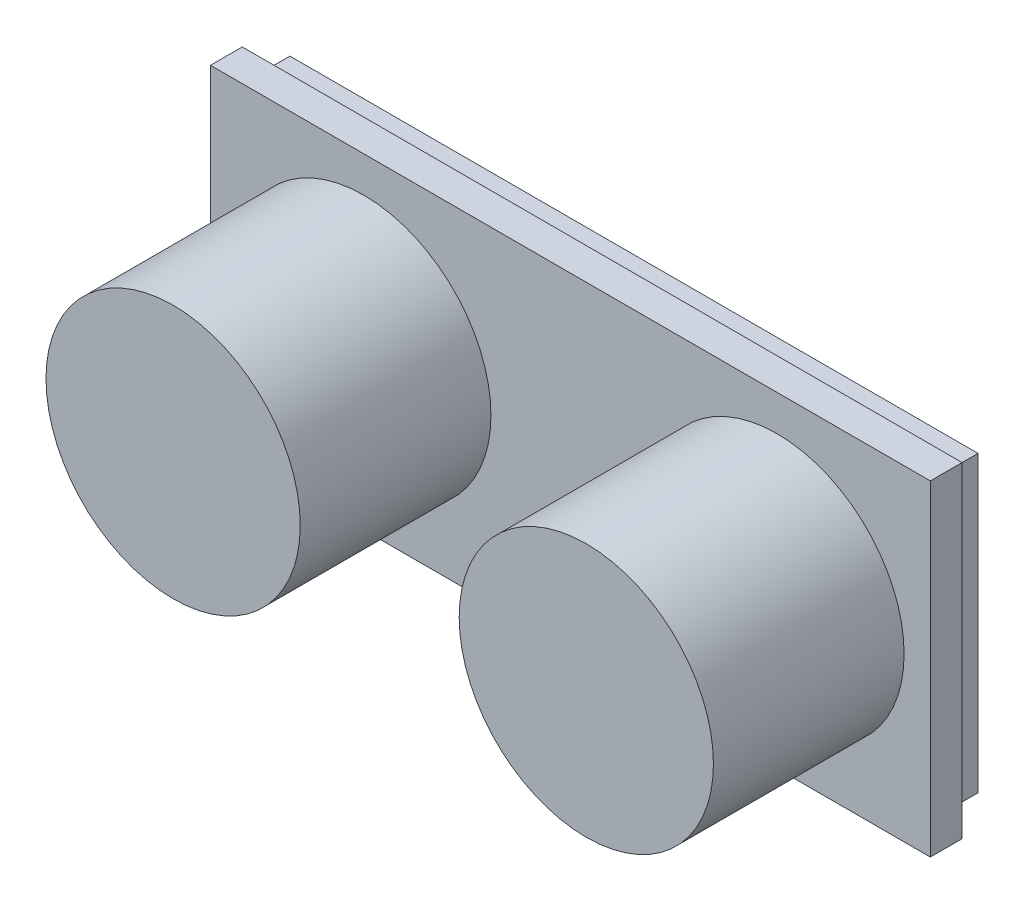
ISO-10303-21;
HEADER;
FILE_DESCRIPTION(('STEP AP214'),'2;1');
FILE_NAME('part.step','',(''),(''),'','','');
FILE_SCHEMA(('AUTOMOTIVE_DESIGN { 1 0 10303 214 1 1 1 1 }'));
ENDSEC;
DATA;
#1=APPLICATION_CONTEXT('core data for automotive mechanical design processes');
#2=APPLICATION_PROTOCOL_DEFINITION('international standard','automotive_design',2000,#1);
#3=PRODUCT_CONTEXT('',#1,'mechanical');
#4=PRODUCT('Part','Part','',(#3));
#5=PRODUCT_RELATED_PRODUCT_CATEGORY('part','',(#4));
#6=PRODUCT_DEFINITION_FORMATION('','',#4);
#7=PRODUCT_DEFINITION_CONTEXT('part definition',#1,'design');
#8=PRODUCT_DEFINITION('design','',#6,#7);
#9=PRODUCT_DEFINITION_SHAPE('','',#8);
#10=(LENGTH_UNIT() NAMED_UNIT(*) SI_UNIT(.MILLI.,.METRE.));
#11=(NAMED_UNIT(*) PLANE_ANGLE_UNIT() SI_UNIT($,.RADIAN.));
#12=(NAMED_UNIT(*) SI_UNIT($,.STERADIAN.) SOLID_ANGLE_UNIT());
#13=UNCERTAINTY_MEASURE_WITH_UNIT(LENGTH_MEASURE(1.E-05),#10,'distance_accuracy_value','');
#14=(GEOMETRIC_REPRESENTATION_CONTEXT(3) GLOBAL_UNCERTAINTY_ASSIGNED_CONTEXT((#13)) GLOBAL_UNIT_ASSIGNED_CONTEXT((#10,
#11,#12)) REPRESENTATION_CONTEXT('',''));
#15=CARTESIAN_POINT('',(0.,0.,0.));
#16=DIRECTION('',(0.,0.,1.));
#17=DIRECTION('',(1.,0.,0.));
#18=AXIS2_PLACEMENT_3D('',#15,#16,#17);
#19=CARTESIAN_POINT('',(0.,0.,0.));
#20=DIRECTION('',(0.,0.,-1.));
#21=DIRECTION('',(-1.,0.,0.));
#22=AXIS2_PLACEMENT_3D('',#19,#20,#21);
#23=PLANE('',#22);
#24=DIRECTION('',(0.,-1.,0.));
#25=VECTOR('',#24,1.);
#26=CARTESIAN_POINT('',(5.,-17.25,0.));
#27=LINE('',#26,#25);
#28=CARTESIAN_POINT('',(5.,-7.25,0.));
#29=VERTEX_POINT('',#28);
#30=CARTESIAN_POINT('',(5.,-10.25,0.));
#31=VERTEX_POINT('',#30);
#32=EDGE_CURVE('E65',#29,#31,#27,.T.);
#33=ORIENTED_EDGE('',*,*,#32,.F.);
#34=DIRECTION('',(1.,0.,0.));
#35=VECTOR('',#34,1.);
#36=CARTESIAN_POINT('',(5.,-7.25,0.));
#37=LINE('',#36,#35);
#38=CARTESIAN_POINT('',(-5.,-7.25,0.));
#39=VERTEX_POINT('',#38);
#40=EDGE_CURVE('E209',#39,#29,#37,.T.);
#41=ORIENTED_EDGE('',*,*,#40,.F.);
#42=DIRECTION('',(0.,1.,0.));
#43=VECTOR('',#42,1.);
#44=CARTESIAN_POINT('',(-5.,-17.25,0.));
#45=LINE('',#44,#43);
#46=CARTESIAN_POINT('',(-5.,-10.25,0.));
#47=VERTEX_POINT('',#46);
#48=EDGE_CURVE('E228',#47,#39,#45,.T.);
#49=ORIENTED_EDGE('',*,*,#48,.F.);
#50=DIRECTION('',(1.,0.,0.));
#51=VECTOR('',#50,1.);
#52=CARTESIAN_POINT('',(-22.65,-10.25,0.));
#53=LINE('',#52,#51);
#54=CARTESIAN_POINT('',(-22.65,-10.25,0.));
#55=VERTEX_POINT('',#54);
#56=EDGE_CURVE('E252',#55,#47,#53,.T.);
#57=ORIENTED_EDGE('',*,*,#56,.F.);
#58=DIRECTION('',(0.,-1.,0.));
#59=VECTOR('',#58,1.);
#60=CARTESIAN_POINT('',(-22.65,-10.25,0.));
#61=LINE('',#60,#59);
#62=CARTESIAN_POINT('',(-22.65,10.25,0.));
#63=VERTEX_POINT('',#62);
#64=EDGE_CURVE('E268',#63,#55,#61,.T.);
#65=ORIENTED_EDGE('',*,*,#64,.F.);
#66=DIRECTION('',(-1.,0.,0.));
#67=VECTOR('',#66,1.);
#68=CARTESIAN_POINT('',(-22.65,10.25,0.));
#69=LINE('',#68,#67);
#70=CARTESIAN_POINT('',(22.65,10.25,0.));
#71=VERTEX_POINT('',#70);
#72=EDGE_CURVE('E265',#71,#63,#69,.T.);
#73=ORIENTED_EDGE('',*,*,#72,.F.);
#74=DIRECTION('',(0.,1.,0.));
#75=VECTOR('',#74,1.);
#76=CARTESIAN_POINT('',(22.65,-10.25,0.));
#77=LINE('',#76,#75);
#78=CARTESIAN_POINT('',(22.65,-10.25,0.));
#79=VERTEX_POINT('',#78);
#80=EDGE_CURVE('E246',#79,#71,#77,.T.);
#81=ORIENTED_EDGE('',*,*,#80,.F.);
#82=EDGE_CURVE('E271',#31,#79,#53,.T.);
#83=ORIENTED_EDGE('',*,*,#82,.F.);
#84=EDGE_LOOP('',(#33,#41,#49,#57,#65,#73,#81,#83));
#85=FACE_BOUND('',#84,.T.);
#86=DIRECTION('',(0.,1.,0.));
#87=VECTOR('',#86,1.);
#88=CARTESIAN_POINT('',(6.,-9.25,0.));
#89=LINE('',#88,#87);
#90=CARTESIAN_POINT('',(6.,-9.25,0.));
#91=VERTEX_POINT('',#90);
#92=CARTESIAN_POINT('',(6.,-6.25,0.));
#93=VERTEX_POINT('',#92);
#94=EDGE_CURVE('E587',#91,#93,#89,.T.);
#95=ORIENTED_EDGE('',*,*,#94,.F.);
#96=DIRECTION('',(-1.,0.,0.));
#97=VECTOR('',#96,1.);
#98=CARTESIAN_POINT('',(21.65,-9.25,0.));
#99=LINE('',#98,#97);
#100=CARTESIAN_POINT('',(21.65,-9.25,0.));
#101=VERTEX_POINT('',#100);
#102=EDGE_CURVE('E186',#101,#91,#99,.T.);
#103=ORIENTED_EDGE('',*,*,#102,.F.);
#104=DIRECTION('',(0.,-1.,0.));
#105=VECTOR('',#104,1.);
#106=CARTESIAN_POINT('',(21.65,9.25,0.));
#107=LINE('',#106,#105);
#108=CARTESIAN_POINT('',(21.65,9.25,0.));
#109=VERTEX_POINT('',#108);
#110=EDGE_CURVE('E182',#109,#101,#107,.T.);
#111=ORIENTED_EDGE('',*,*,#110,.F.);
#112=DIRECTION('',(1.,0.,0.));
#113=VECTOR('',#112,1.);
#114=CARTESIAN_POINT('',(-21.65,9.25,0.));
#115=LINE('',#114,#113);
#116=CARTESIAN_POINT('',(-21.65,9.25,0.));
#117=VERTEX_POINT('',#116);
#118=EDGE_CURVE('E582',#117,#109,#115,.T.);
#119=ORIENTED_EDGE('',*,*,#118,.F.);
#120=DIRECTION('',(0.,1.,0.));
#121=VECTOR('',#120,1.);
#122=CARTESIAN_POINT('',(-21.65,-9.25,0.));
#123=LINE('',#122,#121);
#124=CARTESIAN_POINT('',(-21.65,-9.25,0.));
#125=VERTEX_POINT('',#124);
#126=EDGE_CURVE('E604',#125,#117,#123,.T.);
#127=ORIENTED_EDGE('',*,*,#126,.F.);
#128=DIRECTION('',(-1.,0.,0.));
#129=VECTOR('',#128,1.);
#130=CARTESIAN_POINT('',(-6.,-9.25,0.));
#131=LINE('',#130,#129);
#132=CARTESIAN_POINT('',(-6.,-9.25,0.));
#133=VERTEX_POINT('',#132);
#134=EDGE_CURVE('E601',#133,#125,#131,.T.);
#135=ORIENTED_EDGE('',*,*,#134,.F.);
#136=DIRECTION('',(0.,-1.,0.));
#137=VECTOR('',#136,1.);
#138=CARTESIAN_POINT('',(-6.,-6.25,0.));
#139=LINE('',#138,#137);
#140=CARTESIAN_POINT('',(-6.,-6.25,0.));
#141=VERTEX_POINT('',#140);
#142=EDGE_CURVE('E598',#141,#133,#139,.T.);
#143=ORIENTED_EDGE('',*,*,#142,.F.);
#144=DIRECTION('',(-1.,0.,0.));
#145=VECTOR('',#144,1.);
#146=CARTESIAN_POINT('',(6.,-6.25,0.));
#147=LINE('',#146,#145);
#148=EDGE_CURVE('E591',#93,#141,#147,.T.);
#149=ORIENTED_EDGE('',*,*,#148,.F.);
#150=EDGE_LOOP('',(#95,#103,#111,#119,#127,#135,#143,#149));
#151=FACE_BOUND('',#150,.T.);
#152=ADVANCED_FACE('F41',(#85,#151),#23,.T.);
#153=CARTESIAN_POINT('',(22.65,-10.25,2.));
#154=DIRECTION('',(-1.,0.,0.));
#155=DIRECTION('',(0.,0.,1.));
#156=AXIS2_PLACEMENT_3D('',#153,#154,#155);
#157=PLANE('',#156);
#158=ORIENTED_EDGE('',*,*,#80,.T.);
#159=DIRECTION('',(0.,0.,-1.));
#160=VECTOR('',#159,1.);
#161=CARTESIAN_POINT('',(22.65,10.25,2.));
#162=LINE('',#161,#160);
#163=CARTESIAN_POINT('',(22.65,10.25,2.));
#164=VERTEX_POINT('',#163);
#165=EDGE_CURVE('E287',#164,#71,#162,.T.);
#166=ORIENTED_EDGE('',*,*,#165,.F.);
#167=DIRECTION('',(0.,1.,0.));
#168=VECTOR('',#167,1.);
#169=CARTESIAN_POINT('',(22.65,-10.25,2.));
#170=LINE('',#169,#168);
#171=CARTESIAN_POINT('',(22.65,-10.25,2.));
#172=VERTEX_POINT('',#171);
#173=EDGE_CURVE('E247',#172,#164,#170,.T.);
#174=ORIENTED_EDGE('',*,*,#173,.F.);
#175=DIRECTION('',(0.,0.,-1.));
#176=VECTOR('',#175,1.);
#177=CARTESIAN_POINT('',(22.65,-10.25,2.));
#178=LINE('',#177,#176);
#179=EDGE_CURVE('E261',#172,#79,#178,.T.);
#180=ORIENTED_EDGE('',*,*,#179,.T.);
#181=EDGE_LOOP('',(#158,#166,#174,#180));
#182=FACE_BOUND('',#181,.T.);
#183=ADVANCED_FACE('F43',(#182),#157,.F.);
#184=CARTESIAN_POINT('',(-22.65,10.25,2.));
#185=DIRECTION('',(0.,-1.,0.));
#186=DIRECTION('',(0.,0.,-1.));
#187=AXIS2_PLACEMENT_3D('',#184,#185,#186);
#188=PLANE('',#187);
#189=ORIENTED_EDGE('',*,*,#72,.T.);
#190=DIRECTION('',(0.,0.,-1.));
#191=VECTOR('',#190,1.);
#192=CARTESIAN_POINT('',(-22.65,10.25,2.));
#193=LINE('',#192,#191);
#194=CARTESIAN_POINT('',(-22.65,10.25,2.));
#195=VERTEX_POINT('',#194);
#196=EDGE_CURVE('E283',#195,#63,#193,.T.);
#197=ORIENTED_EDGE('',*,*,#196,.F.);
#198=DIRECTION('',(-1.,0.,0.));
#199=VECTOR('',#198,1.);
#200=CARTESIAN_POINT('',(-22.65,10.25,2.));
#201=LINE('',#200,#199);
#202=EDGE_CURVE('E251',#164,#195,#201,.T.);
#203=ORIENTED_EDGE('',*,*,#202,.F.);
#204=ORIENTED_EDGE('',*,*,#165,.T.);
#205=EDGE_LOOP('',(#189,#197,#203,#204));
#206=FACE_BOUND('',#205,.T.);
#207=ADVANCED_FACE('F332',(#206),#188,.F.);
#208=CARTESIAN_POINT('',(-22.65,-10.25,2.));
#209=DIRECTION('',(1.,0.,0.));
#210=DIRECTION('',(0.,0.,-1.));
#211=AXIS2_PLACEMENT_3D('',#208,#209,#210);
#212=PLANE('',#211);
#213=ORIENTED_EDGE('',*,*,#64,.T.);
#214=DIRECTION('',(0.,0.,-1.));
#215=VECTOR('',#214,1.);
#216=CARTESIAN_POINT('',(-22.65,-10.25,2.));
#217=LINE('',#216,#215);
#218=CARTESIAN_POINT('',(-22.65,-10.25,2.));
#219=VERTEX_POINT('',#218);
#220=EDGE_CURVE('E279',#219,#55,#217,.T.);
#221=ORIENTED_EDGE('',*,*,#220,.F.);
#222=DIRECTION('',(0.,-1.,0.));
#223=VECTOR('',#222,1.);
#224=CARTESIAN_POINT('',(-22.65,-10.25,2.));
#225=LINE('',#224,#223);
#226=EDGE_CURVE('E255',#195,#219,#225,.T.);
#227=ORIENTED_EDGE('',*,*,#226,.F.);
#228=ORIENTED_EDGE('',*,*,#196,.T.);
#229=EDGE_LOOP('',(#213,#221,#227,#228));
#230=FACE_BOUND('',#229,.T.);
#231=ADVANCED_FACE('F338',(#230),#212,.F.);
#232=CARTESIAN_POINT('',(-22.65,-10.25,2.));
#233=DIRECTION('',(0.,1.,0.));
#234=DIRECTION('',(0.,0.,1.));
#235=AXIS2_PLACEMENT_3D('',#232,#233,#234);
#236=PLANE('',#235);
#237=ORIENTED_EDGE('',*,*,#56,.T.);
#238=EDGE_CURVE('E275',#47,#31,#53,.T.);
#239=ORIENTED_EDGE('',*,*,#238,.T.);
#240=ORIENTED_EDGE('',*,*,#82,.T.);
#241=ORIENTED_EDGE('',*,*,#179,.F.);
#242=DIRECTION('',(1.,0.,0.));
#243=VECTOR('',#242,1.);
#244=CARTESIAN_POINT('',(-22.65,-10.25,2.));
#245=LINE('',#244,#243);
#246=EDGE_CURVE('E258',#219,#172,#245,.T.);
#247=ORIENTED_EDGE('',*,*,#246,.F.);
#248=ORIENTED_EDGE('',*,*,#220,.T.);
#249=EDGE_LOOP('',(#237,#239,#240,#241,#247,#248));
#250=FACE_BOUND('',#249,.T.);
#251=ADVANCED_FACE('F322',(#250),#236,.F.);
#252=CARTESIAN_POINT('',(0.,0.,2.));
#253=DIRECTION('',(0.,0.,-1.));
#254=DIRECTION('',(-1.,0.,0.));
#255=AXIS2_PLACEMENT_3D('',#252,#253,#254);
#256=PLANE('',#255);
#257=CARTESIAN_POINT('',(-13.,0.,2.));
#258=DIRECTION('',(0.,0.,-1.));
#259=DIRECTION('',(-1.,0.,0.));
#260=AXIS2_PLACEMENT_3D('',#257,#258,#259);
#261=CIRCLE('',#260,8.);
#262=CARTESIAN_POINT('',(-21.,0.,2.));
#263=VERTEX_POINT('',#262);
#264=EDGE_CURVE('E11',#263,#263,#261,.F.);
#265=ORIENTED_EDGE('',*,*,#264,.F.);
#266=EDGE_LOOP('',(#265));
#267=FACE_BOUND('',#266,.T.);
#268=CARTESIAN_POINT('',(13.,0.,2.));
#269=DIRECTION('',(0.,0.,-1.));
#270=DIRECTION('',(-1.,0.,0.));
#271=AXIS2_PLACEMENT_3D('',#268,#269,#270);
#272=CIRCLE('',#271,8.);
#273=CARTESIAN_POINT('',(5.,0.,2.));
#274=VERTEX_POINT('',#273);
#275=EDGE_CURVE('E50',#274,#274,#272,.F.);
#276=ORIENTED_EDGE('',*,*,#275,.F.);
#277=EDGE_LOOP('',(#276));
#278=FACE_BOUND('',#277,.T.);
#279=ORIENTED_EDGE('',*,*,#173,.T.);
#280=ORIENTED_EDGE('',*,*,#202,.T.);
#281=ORIENTED_EDGE('',*,*,#226,.T.);
#282=ORIENTED_EDGE('',*,*,#246,.T.);
#283=EDGE_LOOP('',(#279,#280,#281,#282));
#284=FACE_BOUND('',#283,.T.);
#285=ADVANCED_FACE('F335',(#267,#278,#284),#256,.F.);
#286=CARTESIAN_POINT('',(0.,0.,0.));
#287=DIRECTION('',(0.,0.,1.));
#288=DIRECTION('',(1.,0.,0.));
#289=AXIS2_PLACEMENT_3D('',#286,#287,#288);
#290=PLANE('',#289);
#291=ORIENTED_EDGE('',*,*,#238,.F.);
#292=CARTESIAN_POINT('',(-5.,-17.25,0.));
#293=VERTEX_POINT('',#292);
#294=EDGE_CURVE('E224',#293,#47,#45,.T.);
#295=ORIENTED_EDGE('',*,*,#294,.F.);
#296=DIRECTION('',(-1.,0.,0.));
#297=VECTOR('',#296,1.);
#298=CARTESIAN_POINT('',(5.,-17.25,0.));
#299=LINE('',#298,#297);
#300=CARTESIAN_POINT('',(5.,-17.25,0.));
#301=VERTEX_POINT('',#300);
#302=EDGE_CURVE('E221',#301,#293,#299,.T.);
#303=ORIENTED_EDGE('',*,*,#302,.F.);
#304=EDGE_CURVE('E203',#31,#301,#27,.T.);
#305=ORIENTED_EDGE('',*,*,#304,.F.);
#306=EDGE_LOOP('',(#291,#295,#303,#305));
#307=FACE_BOUND('',#306,.T.);
#308=ADVANCED_FACE('F315',(#307),#290,.T.);
#309=CARTESIAN_POINT('',(5.,-17.25,-4.));
#310=DIRECTION('',(-1.,0.,0.));
#311=DIRECTION('',(0.,-1.,0.));
#312=AXIS2_PLACEMENT_3D('',#309,#310,#311);
#313=PLANE('',#312);
#314=ORIENTED_EDGE('',*,*,#32,.T.);
#315=ORIENTED_EDGE('',*,*,#304,.T.);
#316=DIRECTION('',(0.,0.,1.));
#317=VECTOR('',#316,1.);
#318=CARTESIAN_POINT('',(5.,-17.25,-4.));
#319=LINE('',#318,#317);
#320=CARTESIAN_POINT('',(5.,-17.25,-4.));
#321=VERTEX_POINT('',#320);
#322=EDGE_CURVE('E242',#321,#301,#319,.T.);
#323=ORIENTED_EDGE('',*,*,#322,.F.);
#324=DIRECTION('',(0.,-1.,0.));
#325=VECTOR('',#324,1.);
#326=CARTESIAN_POINT('',(5.,-17.25,-4.));
#327=LINE('',#326,#325);
#328=CARTESIAN_POINT('',(5.,-7.25,-4.));
#329=VERTEX_POINT('',#328);
#330=EDGE_CURVE('E204',#329,#321,#327,.T.);
#331=ORIENTED_EDGE('',*,*,#330,.F.);
#332=DIRECTION('',(0.,0.,1.));
#333=VECTOR('',#332,1.);
#334=CARTESIAN_POINT('',(5.,-7.25,-4.));
#335=LINE('',#334,#333);
#336=EDGE_CURVE('E218',#329,#29,#335,.T.);
#337=ORIENTED_EDGE('',*,*,#336,.T.);
#338=EDGE_LOOP('',(#314,#315,#323,#331,#337));
#339=FACE_BOUND('',#338,.T.);
#340=ADVANCED_FACE('F355',(#339),#313,.F.);
#341=CARTESIAN_POINT('',(5.,-17.25,-4.));
#342=DIRECTION('',(0.,1.,0.));
#343=DIRECTION('',(0.,0.,1.));
#344=AXIS2_PLACEMENT_3D('',#341,#342,#343);
#345=PLANE('',#344);
#346=ORIENTED_EDGE('',*,*,#302,.T.);
#347=DIRECTION('',(0.,0.,1.));
#348=VECTOR('',#347,1.);
#349=CARTESIAN_POINT('',(-5.,-17.25,-4.));
#350=LINE('',#349,#348);
#351=CARTESIAN_POINT('',(-5.,-17.25,-4.));
#352=VERTEX_POINT('',#351);
#353=EDGE_CURVE('E238',#352,#293,#350,.T.);
#354=ORIENTED_EDGE('',*,*,#353,.F.);
#355=DIRECTION('',(-1.,0.,0.));
#356=VECTOR('',#355,1.);
#357=CARTESIAN_POINT('',(5.,-17.25,-4.));
#358=LINE('',#357,#356);
#359=EDGE_CURVE('E208',#321,#352,#358,.T.);
#360=ORIENTED_EDGE('',*,*,#359,.F.);
#361=ORIENTED_EDGE('',*,*,#322,.T.);
#362=EDGE_LOOP('',(#346,#354,#360,#361));
#363=FACE_BOUND('',#362,.T.);
#364=ADVANCED_FACE('F358',(#363),#345,.F.);
#365=CARTESIAN_POINT('',(-5.,-17.25,-4.));
#366=DIRECTION('',(1.,0.,0.));
#367=DIRECTION('',(0.,1.,0.));
#368=AXIS2_PLACEMENT_3D('',#365,#366,#367);
#369=PLANE('',#368);
#370=ORIENTED_EDGE('',*,*,#294,.T.);
#371=ORIENTED_EDGE('',*,*,#48,.T.);
#372=DIRECTION('',(0.,0.,1.));
#373=VECTOR('',#372,1.);
#374=CARTESIAN_POINT('',(-5.,-7.25,-4.));
#375=LINE('',#374,#373);
#376=CARTESIAN_POINT('',(-5.,-7.25,-4.));
#377=VERTEX_POINT('',#376);
#378=EDGE_CURVE('E234',#377,#39,#375,.T.);
#379=ORIENTED_EDGE('',*,*,#378,.F.);
#380=DIRECTION('',(0.,1.,0.));
#381=VECTOR('',#380,1.);
#382=CARTESIAN_POINT('',(-5.,-17.25,-4.));
#383=LINE('',#382,#381);
#384=EDGE_CURVE('E212',#352,#377,#383,.T.);
#385=ORIENTED_EDGE('',*,*,#384,.F.);
#386=ORIENTED_EDGE('',*,*,#353,.T.);
#387=EDGE_LOOP('',(#370,#371,#379,#385,#386));
#388=FACE_BOUND('',#387,.T.);
#389=ADVANCED_FACE('F298',(#388),#369,.F.);
#390=CARTESIAN_POINT('',(5.,-7.25,-4.));
#391=DIRECTION('',(0.,-1.,0.));
#392=DIRECTION('',(0.,0.,-1.));
#393=AXIS2_PLACEMENT_3D('',#390,#391,#392);
#394=PLANE('',#393);
#395=ORIENTED_EDGE('',*,*,#40,.T.);
#396=ORIENTED_EDGE('',*,*,#336,.F.);
#397=DIRECTION('',(1.,0.,0.));
#398=VECTOR('',#397,1.);
#399=CARTESIAN_POINT('',(5.,-7.25,-4.));
#400=LINE('',#399,#398);
#401=EDGE_CURVE('E215',#377,#329,#400,.T.);
#402=ORIENTED_EDGE('',*,*,#401,.F.);
#403=ORIENTED_EDGE('',*,*,#378,.T.);
#404=EDGE_LOOP('',(#395,#396,#402,#403));
#405=FACE_BOUND('',#404,.T.);
#406=ADVANCED_FACE('F304',(#405),#394,.F.);
#407=CARTESIAN_POINT('',(0.,0.,-4.));
#408=DIRECTION('',(0.,0.,1.));
#409=DIRECTION('',(1.,0.,0.));
#410=AXIS2_PLACEMENT_3D('',#407,#408,#409);
#411=PLANE('',#410);
#412=ORIENTED_EDGE('',*,*,#330,.T.);
#413=ORIENTED_EDGE('',*,*,#359,.T.);
#414=ORIENTED_EDGE('',*,*,#384,.T.);
#415=ORIENTED_EDGE('',*,*,#401,.T.);
#416=EDGE_LOOP('',(#412,#413,#414,#415));
#417=FACE_BOUND('',#416,.T.);
#418=ADVANCED_FACE('F308',(#417),#411,.F.);
#419=CARTESIAN_POINT('',(13.,0.,14.));
#420=DIRECTION('',(0.,0.,-1.));
#421=DIRECTION('',(-1.,0.,0.));
#422=AXIS2_PLACEMENT_3D('',#419,#420,#421);
#423=CYLINDRICAL_SURFACE('',#422,8.);
#424=CARTESIAN_POINT('',(13.,0.,14.));
#425=DIRECTION('',(0.,0.,1.));
#426=DIRECTION('',(1.,0.,0.));
#427=AXIS2_PLACEMENT_3D('',#424,#425,#426);
#428=CIRCLE('',#427,8.);
#429=CARTESIAN_POINT('',(21.,0.,14.));
#430=VERTEX_POINT('',#429);
#431=EDGE_CURVE('E194',#430,#430,#428,.T.);
#432=ORIENTED_EDGE('',*,*,#431,.F.);
#433=EDGE_LOOP('',(#432));
#434=FACE_BOUND('',#433,.T.);
#435=ORIENTED_EDGE('',*,*,#275,.T.);
#436=EDGE_LOOP('',(#435));
#437=FACE_BOUND('',#436,.T.);
#438=ADVANCED_FACE('F370',(#434,#437),#423,.T.);
#439=CARTESIAN_POINT('',(13.,0.,14.));
#440=DIRECTION('',(0.,0.,1.));
#441=DIRECTION('',(1.,0.,0.));
#442=AXIS2_PLACEMENT_3D('',#439,#440,#441);
#443=PLANE('',#442);
#444=ORIENTED_EDGE('',*,*,#431,.T.);
#445=EDGE_LOOP('',(#444));
#446=FACE_BOUND('',#445,.T.);
#447=ADVANCED_FACE('F373',(#446),#443,.T.);
#448=CARTESIAN_POINT('',(-13.,0.,14.));
#449=DIRECTION('',(0.,0.,-1.));
#450=DIRECTION('',(-1.,0.,0.));
#451=AXIS2_PLACEMENT_3D('',#448,#449,#450);
#452=CYLINDRICAL_SURFACE('',#451,8.);
#453=CARTESIAN_POINT('',(-13.,0.,14.));
#454=DIRECTION('',(0.,0.,1.));
#455=DIRECTION('',(-1.,0.,0.));
#456=AXIS2_PLACEMENT_3D('',#453,#454,#455);
#457=CIRCLE('',#456,8.);
#458=CARTESIAN_POINT('',(-21.,0.,14.));
#459=VERTEX_POINT('',#458);
#460=EDGE_CURVE('E189',#459,#459,#457,.T.);
#461=ORIENTED_EDGE('',*,*,#460,.F.);
#462=EDGE_LOOP('',(#461));
#463=FACE_BOUND('',#462,.T.);
#464=ORIENTED_EDGE('',*,*,#264,.T.);
#465=EDGE_LOOP('',(#464));
#466=FACE_BOUND('',#465,.T.);
#467=ADVANCED_FACE('F377',(#463,#466),#452,.T.);
#468=CARTESIAN_POINT('',(-13.,0.,14.));
#469=DIRECTION('',(0.,0.,-1.));
#470=DIRECTION('',(-1.,0.,0.));
#471=AXIS2_PLACEMENT_3D('',#468,#469,#470);
#472=PLANE('',#471);
#473=ORIENTED_EDGE('',*,*,#460,.T.);
#474=EDGE_LOOP('',(#473));
#475=FACE_BOUND('',#474,.T.);
#476=ADVANCED_FACE('F381',(#475),#472,.F.);
#477=CARTESIAN_POINT('',(21.65,-9.25,-2.));
#478=DIRECTION('',(0.,1.,0.));
#479=DIRECTION('',(0.,0.,1.));
#480=AXIS2_PLACEMENT_3D('',#477,#478,#479);
#481=PLANE('',#480);
#482=ORIENTED_EDGE('',*,*,#102,.T.);
#483=DIRECTION('',(0.,0.,1.));
#484=VECTOR('',#483,1.);
#485=CARTESIAN_POINT('',(6.,-9.25,-2.));
#486=LINE('',#485,#484);
#487=CARTESIAN_POINT('',(6.,-9.25,-2.));
#488=VERTEX_POINT('',#487);
#489=EDGE_CURVE('E165',#488,#91,#486,.T.);
#490=ORIENTED_EDGE('',*,*,#489,.F.);
#491=DIRECTION('',(-1.,0.,0.));
#492=VECTOR('',#491,1.);
#493=CARTESIAN_POINT('',(21.65,-9.25,-2.));
#494=LINE('',#493,#492);
#495=CARTESIAN_POINT('',(21.65,-9.25,-2.));
#496=VERTEX_POINT('',#495);
#497=EDGE_CURVE('E173',#496,#488,#494,.T.);
#498=ORIENTED_EDGE('',*,*,#497,.F.);
#499=DIRECTION('',(0.,0.,1.));
#500=VECTOR('',#499,1.);
#501=CARTESIAN_POINT('',(21.65,-9.25,-2.));
#502=LINE('',#501,#500);
#503=EDGE_CURVE('E579',#496,#101,#502,.T.);
#504=ORIENTED_EDGE('',*,*,#503,.T.);
#505=EDGE_LOOP('',(#482,#490,#498,#504));
#506=FACE_BOUND('',#505,.T.);
#507=ADVANCED_FACE('F184',(#506),#481,.F.);
#508=CARTESIAN_POINT('',(6.,-9.25,-2.));
#509=DIRECTION('',(1.,0.,0.));
#510=DIRECTION('',(0.,1.,0.));
#511=AXIS2_PLACEMENT_3D('',#508,#509,#510);
#512=PLANE('',#511);
#513=ORIENTED_EDGE('',*,*,#94,.T.);
#514=DIRECTION('',(0.,0.,1.));
#515=VECTOR('',#514,1.);
#516=CARTESIAN_POINT('',(6.,-6.25,-2.));
#517=LINE('',#516,#515);
#518=CARTESIAN_POINT('',(6.,-6.25,-2.));
#519=VERTEX_POINT('',#518);
#520=EDGE_CURVE('E168',#519,#93,#517,.T.);
#521=ORIENTED_EDGE('',*,*,#520,.F.);
#522=DIRECTION('',(0.,1.,0.));
#523=VECTOR('',#522,1.);
#524=CARTESIAN_POINT('',(6.,-9.25,-2.));
#525=LINE('',#524,#523);
#526=EDGE_CURVE('E161',#488,#519,#525,.T.);
#527=ORIENTED_EDGE('',*,*,#526,.F.);
#528=ORIENTED_EDGE('',*,*,#489,.T.);
#529=EDGE_LOOP('',(#513,#521,#527,#528));
#530=FACE_BOUND('',#529,.T.);
#531=ADVANCED_FACE('F163',(#530),#512,.F.);
#532=CARTESIAN_POINT('',(6.,-6.25,-2.));
#533=DIRECTION('',(0.,1.,0.));
#534=DIRECTION('',(0.,0.,1.));
#535=AXIS2_PLACEMENT_3D('',#532,#533,#534);
#536=PLANE('',#535);
#537=ORIENTED_EDGE('',*,*,#148,.T.);
#538=DIRECTION('',(0.,0.,1.));
#539=VECTOR('',#538,1.);
#540=CARTESIAN_POINT('',(-6.,-6.25,-2.));
#541=LINE('',#540,#539);
#542=CARTESIAN_POINT('',(-6.,-6.25,-2.));
#543=VERTEX_POINT('',#542);
#544=EDGE_CURVE('E196',#543,#141,#541,.T.);
#545=ORIENTED_EDGE('',*,*,#544,.F.);
#546=DIRECTION('',(-1.,0.,0.));
#547=VECTOR('',#546,1.);
#548=CARTESIAN_POINT('',(6.,-6.25,-2.));
#549=LINE('',#548,#547);
#550=EDGE_CURVE('E172',#519,#543,#549,.T.);
#551=ORIENTED_EDGE('',*,*,#550,.F.);
#552=ORIENTED_EDGE('',*,*,#520,.T.);
#553=EDGE_LOOP('',(#537,#545,#551,#552));
#554=FACE_BOUND('',#553,.T.);
#555=ADVANCED_FACE('F390',(#554),#536,.F.);
#556=CARTESIAN_POINT('',(-6.,-6.25,-2.));
#557=DIRECTION('',(-1.,0.,0.));
#558=DIRECTION('',(0.,-1.,0.));
#559=AXIS2_PLACEMENT_3D('',#556,#557,#558);
#560=PLANE('',#559);
#561=ORIENTED_EDGE('',*,*,#142,.T.);
#562=DIRECTION('',(0.,0.,1.));
#563=VECTOR('',#562,1.);
#564=CARTESIAN_POINT('',(-6.,-9.25,-2.));
#565=LINE('',#564,#563);
#566=CARTESIAN_POINT('',(-6.,-9.25,-2.));
#567=VERTEX_POINT('',#566);
#568=EDGE_CURVE('E619',#567,#133,#565,.T.);
#569=ORIENTED_EDGE('',*,*,#568,.F.);
#570=DIRECTION('',(0.,-1.,0.));
#571=VECTOR('',#570,1.);
#572=CARTESIAN_POINT('',(-6.,-6.25,-2.));
#573=LINE('',#572,#571);
#574=EDGE_CURVE('E628',#543,#567,#573,.T.);
#575=ORIENTED_EDGE('',*,*,#574,.F.);
#576=ORIENTED_EDGE('',*,*,#544,.T.);
#577=EDGE_LOOP('',(#561,#569,#575,#576));
#578=FACE_BOUND('',#577,.T.);
#579=ADVANCED_FACE('F393',(#578),#560,.F.);
#580=CARTESIAN_POINT('',(-6.,-9.25,-2.));
#581=DIRECTION('',(0.,1.,0.));
#582=DIRECTION('',(0.,0.,1.));
#583=AXIS2_PLACEMENT_3D('',#580,#581,#582);
#584=PLANE('',#583);
#585=ORIENTED_EDGE('',*,*,#134,.T.);
#586=DIRECTION('',(0.,0.,1.));
#587=VECTOR('',#586,1.);
#588=CARTESIAN_POINT('',(-21.65,-9.25,-2.));
#589=LINE('',#588,#587);
#590=CARTESIAN_POINT('',(-21.65,-9.25,-2.));
#591=VERTEX_POINT('',#590);
#592=EDGE_CURVE('E615',#591,#125,#589,.T.);
#593=ORIENTED_EDGE('',*,*,#592,.F.);
#594=DIRECTION('',(-1.,0.,0.));
#595=VECTOR('',#594,1.);
#596=CARTESIAN_POINT('',(-6.,-9.25,-2.));
#597=LINE('',#596,#595);
#598=EDGE_CURVE('E639',#567,#591,#597,.T.);
#599=ORIENTED_EDGE('',*,*,#598,.F.);
#600=ORIENTED_EDGE('',*,*,#568,.T.);
#601=EDGE_LOOP('',(#585,#593,#599,#600));
#602=FACE_BOUND('',#601,.T.);
#603=ADVANCED_FACE('F397',(#602),#584,.F.);
#604=CARTESIAN_POINT('',(-21.65,-9.25,-2.));
#605=DIRECTION('',(1.,0.,0.));
#606=DIRECTION('',(0.,0.,-1.));
#607=AXIS2_PLACEMENT_3D('',#604,#605,#606);
#608=PLANE('',#607);
#609=ORIENTED_EDGE('',*,*,#126,.T.);
#610=DIRECTION('',(0.,0.,1.));
#611=VECTOR('',#610,1.);
#612=CARTESIAN_POINT('',(-21.65,9.25,-2.));
#613=LINE('',#612,#611);
#614=CARTESIAN_POINT('',(-21.65,9.25,-2.));
#615=VERTEX_POINT('',#614);
#616=EDGE_CURVE('E611',#615,#117,#613,.T.);
#617=ORIENTED_EDGE('',*,*,#616,.F.);
#618=DIRECTION('',(0.,1.,0.));
#619=VECTOR('',#618,1.);
#620=CARTESIAN_POINT('',(-21.65,-9.25,-2.));
#621=LINE('',#620,#619);
#622=EDGE_CURVE('E635',#591,#615,#621,.T.);
#623=ORIENTED_EDGE('',*,*,#622,.F.);
#624=ORIENTED_EDGE('',*,*,#592,.T.);
#625=EDGE_LOOP('',(#609,#617,#623,#624));
#626=FACE_BOUND('',#625,.T.);
#627=ADVANCED_FACE('F401',(#626),#608,.F.);
#628=CARTESIAN_POINT('',(-21.65,9.25,-2.));
#629=DIRECTION('',(0.,-1.,0.));
#630=DIRECTION('',(0.,0.,-1.));
#631=AXIS2_PLACEMENT_3D('',#628,#629,#630);
#632=PLANE('',#631);
#633=ORIENTED_EDGE('',*,*,#118,.T.);
#634=DIRECTION('',(0.,0.,1.));
#635=VECTOR('',#634,1.);
#636=CARTESIAN_POINT('',(21.65,9.25,-2.));
#637=LINE('',#636,#635);
#638=CARTESIAN_POINT('',(21.65,9.25,-2.));
#639=VERTEX_POINT('',#638);
#640=EDGE_CURVE('E57',#639,#109,#637,.T.);
#641=ORIENTED_EDGE('',*,*,#640,.F.);
#642=DIRECTION('',(1.,0.,0.));
#643=VECTOR('',#642,1.);
#644=CARTESIAN_POINT('',(-21.65,9.25,-2.));
#645=LINE('',#644,#643);
#646=EDGE_CURVE('E638',#615,#639,#645,.T.);
#647=ORIENTED_EDGE('',*,*,#646,.F.);
#648=ORIENTED_EDGE('',*,*,#616,.T.);
#649=EDGE_LOOP('',(#633,#641,#647,#648));
#650=FACE_BOUND('',#649,.T.);
#651=ADVANCED_FACE('F405',(#650),#632,.F.);
#652=CARTESIAN_POINT('',(21.65,9.25,-2.));
#653=DIRECTION('',(-1.,0.,0.));
#654=DIRECTION('',(0.,0.,1.));
#655=AXIS2_PLACEMENT_3D('',#652,#653,#654);
#656=PLANE('',#655);
#657=ORIENTED_EDGE('',*,*,#110,.T.);
#658=ORIENTED_EDGE('',*,*,#503,.F.);
#659=DIRECTION('',(0.,-1.,0.));
#660=VECTOR('',#659,1.);
#661=CARTESIAN_POINT('',(21.65,9.25,-2.));
#662=LINE('',#661,#660);
#663=EDGE_CURVE('E177',#639,#496,#662,.T.);
#664=ORIENTED_EDGE('',*,*,#663,.F.);
#665=ORIENTED_EDGE('',*,*,#640,.T.);
#666=EDGE_LOOP('',(#657,#658,#664,#665));
#667=FACE_BOUND('',#666,.T.);
#668=ADVANCED_FACE('F409',(#667),#656,.F.);
#669=CARTESIAN_POINT('',(0.,0.,-2.));
#670=DIRECTION('',(0.,0.,-1.));
#671=DIRECTION('',(-1.,0.,0.));
#672=AXIS2_PLACEMENT_3D('',#669,#670,#671);
#673=PLANE('',#672);
#674=ORIENTED_EDGE('',*,*,#497,.T.);
#675=ORIENTED_EDGE('',*,*,#526,.T.);
#676=ORIENTED_EDGE('',*,*,#550,.T.);
#677=ORIENTED_EDGE('',*,*,#574,.T.);
#678=ORIENTED_EDGE('',*,*,#598,.T.);
#679=ORIENTED_EDGE('',*,*,#622,.T.);
#680=ORIENTED_EDGE('',*,*,#646,.T.);
#681=ORIENTED_EDGE('',*,*,#663,.T.);
#682=EDGE_LOOP('',(#674,#675,#676,#677,#678,#679,#680,#681));
#683=FACE_BOUND('',#682,.T.);
#684=ADVANCED_FACE('F176',(#683),#673,.T.);
#685=CLOSED_SHELL('',(#152,#183,#207,#231,#251,#285,#308,#340,#364,#389,#406,#418,#438,#447,
#467,#476,#507,#531,#555,#579,#603,#627,#651,#668,#684));
#686=MANIFOLD_SOLID_BREP('B2',#685);
#687=ADVANCED_BREP_SHAPE_REPRESENTATION('',(#18,#686),#14);
#688=SHAPE_DEFINITION_REPRESENTATION(#9,#687);
ENDSEC;
END-ISO-10303-21;
